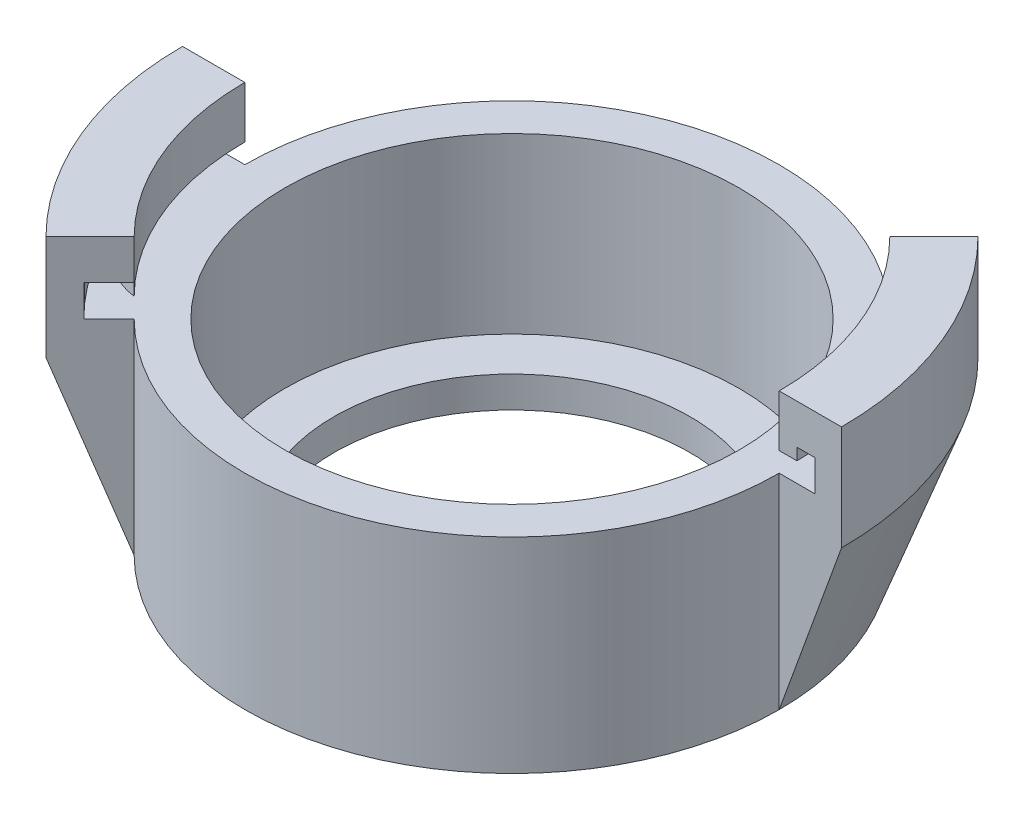
ISO-10303-21;
HEADER;
FILE_DESCRIPTION(('STEP AP214'),'2;1');
FILE_NAME('part.step','',(''),(''),'','','');
FILE_SCHEMA(('AUTOMOTIVE_DESIGN { 1 0 10303 214 1 1 1 1 }'));
ENDSEC;
DATA;
#1=APPLICATION_CONTEXT('core data for automotive mechanical design processes');
#2=APPLICATION_PROTOCOL_DEFINITION('international standard','automotive_design',2000,#1);
#3=PRODUCT_CONTEXT('',#1,'mechanical');
#4=PRODUCT('Part','Part','',(#3));
#5=PRODUCT_RELATED_PRODUCT_CATEGORY('part','',(#4));
#6=PRODUCT_DEFINITION_FORMATION('','',#4);
#7=PRODUCT_DEFINITION_CONTEXT('part definition',#1,'design');
#8=PRODUCT_DEFINITION('design','',#6,#7);
#9=PRODUCT_DEFINITION_SHAPE('','',#8);
#10=(LENGTH_UNIT() NAMED_UNIT(*) SI_UNIT(.MILLI.,.METRE.));
#11=(NAMED_UNIT(*) PLANE_ANGLE_UNIT() SI_UNIT($,.RADIAN.));
#12=(NAMED_UNIT(*) SI_UNIT($,.STERADIAN.) SOLID_ANGLE_UNIT());
#13=UNCERTAINTY_MEASURE_WITH_UNIT(LENGTH_MEASURE(1.E-05),#10,'distance_accuracy_value','');
#14=(GEOMETRIC_REPRESENTATION_CONTEXT(3) GLOBAL_UNCERTAINTY_ASSIGNED_CONTEXT((#13)) GLOBAL_UNIT_ASSIGNED_CONTEXT((#10,
#11,#12)) REPRESENTATION_CONTEXT('',''));
#15=CARTESIAN_POINT('',(0.,0.,0.));
#16=DIRECTION('',(0.,0.,1.));
#17=DIRECTION('',(1.,0.,0.));
#18=AXIS2_PLACEMENT_3D('',#15,#16,#17);
#19=CARTESIAN_POINT('',(0.,23.,0.));
#20=DIRECTION('',(0.,-1.,0.));
#21=DIRECTION('',(0.,0.,-1.));
#22=AXIS2_PLACEMENT_3D('',#19,#20,#21);
#23=CYLINDRICAL_SURFACE('',#22,30.);
#24=DIRECTION('',(0.,1.,0.));
#25=VECTOR('',#24,1.);
#26=CARTESIAN_POINT('',(21.2132034355964,0.,-21.2132034355964));
#27=LINE('',#26,#25);
#28=CARTESIAN_POINT('',(21.2132034355964,0.,-21.2132034355964));
#29=VERTEX_POINT('',#28);
#30=CARTESIAN_POINT('',(21.2132034355964,23.,-21.2132034355964));
#31=VERTEX_POINT('',#30);
#32=EDGE_CURVE('E255',#29,#31,#27,.T.);
#33=ORIENTED_EDGE('',*,*,#32,.F.);
#34=CARTESIAN_POINT('',(0.,0.,0.));
#35=DIRECTION('',(0.,1.,0.));
#36=DIRECTION('',(0.,0.,1.));
#37=AXIS2_PLACEMENT_3D('',#34,#35,#36);
#38=CIRCLE('',#37,30.);
#39=CARTESIAN_POINT('',(-30.,0.,0.));
#40=VERTEX_POINT('',#39);
#41=EDGE_CURVE('E399',#29,#40,#38,.T.);
#42=ORIENTED_EDGE('',*,*,#41,.T.);
#43=DIRECTION('',(0.,1.,0.));
#44=VECTOR('',#43,1.);
#45=CARTESIAN_POINT('',(-30.,0.,0.));
#46=LINE('',#45,#44);
#47=CARTESIAN_POINT('',(-30.,23.,0.));
#48=VERTEX_POINT('',#47);
#49=EDGE_CURVE('E324',#40,#48,#46,.T.);
#50=ORIENTED_EDGE('',*,*,#49,.T.);
#51=CARTESIAN_POINT('',(0.,23.,0.));
#52=DIRECTION('',(0.,1.,0.));
#53=DIRECTION('',(0.,0.,1.));
#54=AXIS2_PLACEMENT_3D('',#51,#52,#53);
#55=CIRCLE('',#54,30.);
#56=EDGE_CURVE('E404',#31,#48,#55,.T.);
#57=ORIENTED_EDGE('',*,*,#56,.F.);
#58=EDGE_LOOP('',(#33,#42,#50,#57));
#59=FACE_BOUND('',#58,.T.);
#60=ADVANCED_FACE('F41',(#59),#23,.T.);
#61=CARTESIAN_POINT('',(0.,23.,0.));
#62=DIRECTION('',(0.,1.,0.));
#63=DIRECTION('',(0.,0.,1.));
#64=AXIS2_PLACEMENT_3D('',#61,#62,#63);
#65=PLANE('',#64);
#66=CARTESIAN_POINT('',(-21.2132034355964,23.,21.2132034355965));
#67=VERTEX_POINT('',#66);
#68=CARTESIAN_POINT('',(30.,23.,0.));
#69=VERTEX_POINT('',#68);
#70=EDGE_CURVE('E400',#67,#69,#55,.T.);
#71=ORIENTED_EDGE('',*,*,#70,.T.);
#72=DIRECTION('',(-1.,0.,0.));
#73=VECTOR('',#72,1.);
#74=CARTESIAN_POINT('',(0.,23.,0.));
#75=LINE('',#74,#73);
#76=CARTESIAN_POINT('',(34.,23.,0.));
#77=VERTEX_POINT('',#76);
#78=EDGE_CURVE('E277',#77,#69,#75,.T.);
#79=ORIENTED_EDGE('',*,*,#78,.F.);
#80=CARTESIAN_POINT('',(0.,23.,0.));
#81=DIRECTION('',(0.,1.,0.));
#82=DIRECTION('',(-0.707106781186548,0.,-0.707106781186547));
#83=AXIS2_PLACEMENT_3D('',#80,#81,#82);
#84=CIRCLE('',#83,34.);
#85=CARTESIAN_POINT('',(24.0416305603426,23.,-24.0416305603426));
#86=VERTEX_POINT('',#85);
#87=EDGE_CURVE('E315',#77,#86,#84,.T.);
#88=ORIENTED_EDGE('',*,*,#87,.T.);
#89=DIRECTION('',(-0.707106781186547,0.,0.707106781186548));
#90=VECTOR('',#89,1.);
#91=CARTESIAN_POINT('',(0.,23.,0.));
#92=LINE('',#91,#90);
#93=EDGE_CURVE('E258',#86,#31,#92,.T.);
#94=ORIENTED_EDGE('',*,*,#93,.T.);
#95=ORIENTED_EDGE('',*,*,#56,.T.);
#96=DIRECTION('',(1.,0.,0.));
#97=VECTOR('',#96,1.);
#98=CARTESIAN_POINT('',(0.,23.,0.));
#99=LINE('',#98,#97);
#100=CARTESIAN_POINT('',(-34.,23.,0.));
#101=VERTEX_POINT('',#100);
#102=EDGE_CURVE('E327',#101,#48,#99,.T.);
#103=ORIENTED_EDGE('',*,*,#102,.F.);
#104=CARTESIAN_POINT('',(0.,23.,0.));
#105=DIRECTION('',(0.,-1.,0.));
#106=DIRECTION('',(0.,0.,-1.));
#107=AXIS2_PLACEMENT_3D('',#104,#105,#106);
#108=CIRCLE('',#107,34.);
#109=CARTESIAN_POINT('',(-24.0416305603426,23.,24.0416305603427));
#110=VERTEX_POINT('',#109);
#111=EDGE_CURVE('E388',#110,#101,#108,.T.);
#112=ORIENTED_EDGE('',*,*,#111,.F.);
#113=DIRECTION('',(0.707106781186546,0.,-0.707106781186549));
#114=VECTOR('',#113,1.);
#115=CARTESIAN_POINT('',(0.,23.,0.));
#116=LINE('',#115,#114);
#117=EDGE_CURVE('E357',#110,#67,#116,.T.);
#118=ORIENTED_EDGE('',*,*,#117,.T.);
#119=EDGE_LOOP('',(#71,#79,#88,#94,#95,#103,#112,#118));
#120=FACE_BOUND('',#119,.T.);
#121=CARTESIAN_POINT('',(0.,23.,0.));
#122=DIRECTION('',(0.,1.,0.));
#123=DIRECTION('',(0.,0.,1.));
#124=AXIS2_PLACEMENT_3D('',#121,#122,#123);
#125=CIRCLE('',#124,25.5);
#126=CARTESIAN_POINT('',(0.,23.,25.5));
#127=VERTEX_POINT('',#126);
#128=EDGE_CURVE('E394',#127,#127,#125,.T.);
#129=ORIENTED_EDGE('',*,*,#128,.F.);
#130=EDGE_LOOP('',(#129));
#131=FACE_BOUND('',#130,.T.);
#132=ADVANCED_FACE('F470',(#120,#131),#65,.T.);
#133=CARTESIAN_POINT('',(0.,0.,0.));
#134=DIRECTION('',(0.,1.,0.));
#135=DIRECTION('',(0.,0.,1.));
#136=AXIS2_PLACEMENT_3D('',#133,#134,#135);
#137=PLANE('',#136);
#138=CARTESIAN_POINT('',(-21.2132034355964,0.,21.2132034355965));
#139=VERTEX_POINT('',#138);
#140=EDGE_CURVE('E405',#40,#139,#38,.T.);
#141=ORIENTED_EDGE('',*,*,#140,.F.);
#142=ORIENTED_EDGE('',*,*,#41,.F.);
#143=CARTESIAN_POINT('',(0.,0.,0.));
#144=DIRECTION('',(0.,1.,0.));
#145=DIRECTION('',(-0.707106781186548,0.,-0.707106781186547));
#146=AXIS2_PLACEMENT_3D('',#143,#144,#145);
#147=CIRCLE('',#146,30.);
#148=CARTESIAN_POINT('',(30.,0.,0.));
#149=VERTEX_POINT('',#148);
#150=EDGE_CURVE('E318',#149,#29,#147,.T.);
#151=ORIENTED_EDGE('',*,*,#150,.F.);
#152=EDGE_CURVE('E408',#139,#149,#38,.T.);
#153=ORIENTED_EDGE('',*,*,#152,.F.);
#154=EDGE_LOOP('',(#141,#142,#151,#153));
#155=FACE_BOUND('',#154,.T.);
#156=CARTESIAN_POINT('',(0.,0.,0.));
#157=DIRECTION('',(0.,1.,0.));
#158=DIRECTION('',(0.,0.,1.));
#159=AXIS2_PLACEMENT_3D('',#156,#157,#158);
#160=CIRCLE('',#159,20.);
#161=CARTESIAN_POINT('',(0.,0.,20.));
#162=VERTEX_POINT('',#161);
#163=EDGE_CURVE('E390',#162,#162,#160,.T.);
#164=ORIENTED_EDGE('',*,*,#163,.T.);
#165=EDGE_LOOP('',(#164));
#166=FACE_BOUND('',#165,.T.);
#167=ADVANCED_FACE('F476',(#155,#166),#137,.F.);
#168=ORIENTED_EDGE('',*,*,#152,.T.);
#169=DIRECTION('',(0.,1.,0.));
#170=VECTOR('',#169,1.);
#171=CARTESIAN_POINT('',(30.,0.,0.));
#172=LINE('',#171,#170);
#173=EDGE_CURVE('E275',#149,#69,#172,.T.);
#174=ORIENTED_EDGE('',*,*,#173,.T.);
#175=ORIENTED_EDGE('',*,*,#70,.F.);
#176=DIRECTION('',(0.,1.,0.));
#177=VECTOR('',#176,1.);
#178=CARTESIAN_POINT('',(-21.2132034355964,0.,21.2132034355965));
#179=LINE('',#178,#177);
#180=EDGE_CURVE('E354',#139,#67,#179,.T.);
#181=ORIENTED_EDGE('',*,*,#180,.F.);
#182=EDGE_LOOP('',(#168,#174,#175,#181));
#183=FACE_BOUND('',#182,.T.);
#184=ADVANCED_FACE('F43',(#183),#23,.T.);
#185=CARTESIAN_POINT('',(0.,23.,0.));
#186=DIRECTION('',(0.,-1.,0.));
#187=DIRECTION('',(0.,0.,-1.));
#188=AXIS2_PLACEMENT_3D('',#185,#186,#187);
#189=CYLINDRICAL_SURFACE('',#188,25.5);
#190=CARTESIAN_POINT('',(0.,3.5,0.));
#191=DIRECTION('',(0.,1.,0.));
#192=DIRECTION('',(0.,0.,1.));
#193=AXIS2_PLACEMENT_3D('',#190,#191,#192);
#194=CIRCLE('',#193,25.5);
#195=CARTESIAN_POINT('',(0.,3.5,25.5));
#196=VERTEX_POINT('',#195);
#197=EDGE_CURVE('E403',#196,#196,#194,.T.);
#198=ORIENTED_EDGE('',*,*,#197,.F.);
#199=EDGE_LOOP('',(#198));
#200=FACE_BOUND('',#199,.T.);
#201=ORIENTED_EDGE('',*,*,#128,.T.);
#202=EDGE_LOOP('',(#201));
#203=FACE_BOUND('',#202,.T.);
#204=ADVANCED_FACE('F480',(#200,#203),#189,.F.);
#205=CARTESIAN_POINT('',(0.,3.5,0.));
#206=DIRECTION('',(0.,1.,0.));
#207=DIRECTION('',(0.,0.,1.));
#208=AXIS2_PLACEMENT_3D('',#205,#206,#207);
#209=PLANE('',#208);
#210=ORIENTED_EDGE('',*,*,#197,.T.);
#211=EDGE_LOOP('',(#210));
#212=FACE_BOUND('',#211,.T.);
#213=CARTESIAN_POINT('',(0.,3.5,0.));
#214=DIRECTION('',(0.,1.,0.));
#215=DIRECTION('',(0.,0.,1.));
#216=AXIS2_PLACEMENT_3D('',#213,#214,#215);
#217=CIRCLE('',#216,20.);
#218=CARTESIAN_POINT('',(0.,3.5,20.));
#219=VERTEX_POINT('',#218);
#220=EDGE_CURVE('E391',#219,#219,#217,.T.);
#221=ORIENTED_EDGE('',*,*,#220,.F.);
#222=EDGE_LOOP('',(#221));
#223=FACE_BOUND('',#222,.T.);
#224=ADVANCED_FACE('F487',(#212,#223),#209,.T.);
#225=CARTESIAN_POINT('',(0.,3.5,0.));
#226=DIRECTION('',(0.,-1.,0.));
#227=DIRECTION('',(0.,0.,-1.));
#228=AXIS2_PLACEMENT_3D('',#225,#226,#227);
#229=CYLINDRICAL_SURFACE('',#228,20.);
#230=ORIENTED_EDGE('',*,*,#220,.T.);
#231=EDGE_LOOP('',(#230));
#232=FACE_BOUND('',#231,.T.);
#233=ORIENTED_EDGE('',*,*,#163,.F.);
#234=EDGE_LOOP('',(#233));
#235=FACE_BOUND('',#234,.T.);
#236=ADVANCED_FACE('F570',(#232,#235),#229,.F.);
#237=CARTESIAN_POINT('',(0.,0.,0.));
#238=DIRECTION('',(0.,1.,0.));
#239=DIRECTION('',(0.,0.,1.));
#240=AXIS2_PLACEMENT_3D('',#237,#238,#239);
#241=CONICAL_SURFACE('',#240,30.,0.349104990963465);
#242=ORIENTED_EDGE('',*,*,#140,.T.);
#243=DIRECTION('',(-0.241870769920647,0.939679233204601,0.241870769920648));
#244=VECTOR('',#243,1.);
#245=CARTESIAN_POINT('',(-18.7311962947298,-9.64271361811531,18.7311962947299));
#246=LINE('',#245,#244);
#247=CARTESIAN_POINT('',(-26.1629509039022,19.23,26.1629509039023));
#248=VERTEX_POINT('',#247);
#249=EDGE_CURVE('E351',#139,#248,#246,.T.);
#250=ORIENTED_EDGE('',*,*,#249,.T.);
#251=CARTESIAN_POINT('',(0.,19.23,0.));
#252=DIRECTION('',(0.,-1.,0.));
#253=DIRECTION('',(0.,0.,-1.));
#254=AXIS2_PLACEMENT_3D('',#251,#252,#253);
#255=CIRCLE('',#254,37.);
#256=CARTESIAN_POINT('',(-37.,19.23,0.));
#257=VERTEX_POINT('',#256);
#258=EDGE_CURVE('E374',#248,#257,#255,.T.);
#259=ORIENTED_EDGE('',*,*,#258,.T.);
#260=DIRECTION('',(-0.342056923163402,0.939679233204601,0.));
#261=VECTOR('',#260,1.);
#262=CARTESIAN_POINT('',(-26.4899118394796,-9.64271361811531,0.));
#263=LINE('',#262,#261);
#264=EDGE_CURVE('E321',#40,#257,#263,.T.);
#265=ORIENTED_EDGE('',*,*,#264,.F.);
#266=EDGE_LOOP('',(#242,#250,#259,#265));
#267=FACE_BOUND('',#266,.T.);
#268=ADVANCED_FACE('F540',(#267),#241,.T.);
#269=CARTESIAN_POINT('',(0.,0.,0.));
#270=DIRECTION('',(0.,-1.,0.));
#271=DIRECTION('',(0.,0.,-1.));
#272=AXIS2_PLACEMENT_3D('',#269,#270,#271);
#273=CYLINDRICAL_SURFACE('',#272,34.);
#274=CARTESIAN_POINT('',(0.,26.5196514633318,0.));
#275=DIRECTION('',(0.,-1.,0.));
#276=DIRECTION('',(0.,0.,-1.));
#277=AXIS2_PLACEMENT_3D('',#274,#275,#276);
#278=CIRCLE('',#277,34.);
#279=CARTESIAN_POINT('',(-24.0416305603426,26.5196514633318,24.0416305603427));
#280=VERTEX_POINT('',#279);
#281=CARTESIAN_POINT('',(-34.,26.5196514633318,0.));
#282=VERTEX_POINT('',#281);
#283=EDGE_CURVE('E386',#280,#282,#278,.T.);
#284=ORIENTED_EDGE('',*,*,#283,.F.);
#285=DIRECTION('',(0.,-1.,0.));
#286=VECTOR('',#285,1.);
#287=CARTESIAN_POINT('',(-24.0416305603426,0.,24.0416305603427));
#288=LINE('',#287,#286);
#289=EDGE_CURVE('E360',#280,#110,#288,.T.);
#290=ORIENTED_EDGE('',*,*,#289,.T.);
#291=ORIENTED_EDGE('',*,*,#111,.T.);
#292=DIRECTION('',(0.,-1.,0.));
#293=VECTOR('',#292,1.);
#294=CARTESIAN_POINT('',(-34.,0.,0.));
#295=LINE('',#294,#293);
#296=EDGE_CURVE('E330',#282,#101,#295,.T.);
#297=ORIENTED_EDGE('',*,*,#296,.F.);
#298=EDGE_LOOP('',(#284,#290,#291,#297));
#299=FACE_BOUND('',#298,.T.);
#300=ADVANCED_FACE('F432',(#299),#273,.F.);
#301=CARTESIAN_POINT('',(0.,26.5196514633318,0.));
#302=DIRECTION('',(0.,-1.,0.));
#303=DIRECTION('',(0.,0.,-1.));
#304=AXIS2_PLACEMENT_3D('',#301,#302,#303);
#305=PLANE('',#304);
#306=DIRECTION('',(-0.227602896185762,0.,-0.973754035497596));
#307=VECTOR('',#306,1.);
#308=CARTESIAN_POINT('',(-29.0437776567196,26.5196514633318,6.78862183864194));
#309=LINE('',#308,#307);
#310=CARTESIAN_POINT('',(-25.6722110926262,26.5196514633318,21.2132034355965));
#311=VERTEX_POINT('',#310);
#312=CARTESIAN_POINT('',(-26.4054134353672,26.5196514633318,18.0763420333686));
#313=VERTEX_POINT('',#312);
#314=EDGE_CURVE('E250',#311,#313,#309,.T.);
#315=ORIENTED_EDGE('',*,*,#314,.F.);
#316=DIRECTION('',(-0.694720375088052,0.,-0.719279917999603));
#317=VECTOR('',#316,1.);
#318=CARTESIAN_POINT('',(-23.8820716837365,26.5196514633318,23.0666273071374));
#319=LINE('',#318,#317);
#320=CARTESIAN_POINT('',(-23.4814311563308,26.5196514633318,23.4814311563309));
#321=VERTEX_POINT('',#320);
#322=EDGE_CURVE('E242',#321,#311,#319,.T.);
#323=ORIENTED_EDGE('',*,*,#322,.F.);
#324=DIRECTION('',(-0.707106781186546,0.,0.707106781186549));
#325=VECTOR('',#324,1.);
#326=CARTESIAN_POINT('',(0.,26.5196514633318,0.));
#327=LINE('',#326,#325);
#328=EDGE_CURVE('E363',#321,#280,#327,.T.);
#329=ORIENTED_EDGE('',*,*,#328,.T.);
#330=ORIENTED_EDGE('',*,*,#283,.T.);
#331=DIRECTION('',(-1.,0.,0.));
#332=VECTOR('',#331,1.);
#333=CARTESIAN_POINT('',(0.,26.5196514633318,0.));
#334=LINE('',#333,#332);
#335=CARTESIAN_POINT('',(-32.,26.5196514633318,0.));
#336=VERTEX_POINT('',#335);
#337=EDGE_CURVE('E333',#336,#282,#334,.T.);
#338=ORIENTED_EDGE('',*,*,#337,.F.);
#339=CARTESIAN_POINT('',(0.,26.5196514633318,0.));
#340=DIRECTION('',(0.,-1.,0.));
#341=DIRECTION('',(0.,0.,-1.));
#342=AXIS2_PLACEMENT_3D('',#339,#340,#341);
#343=CIRCLE('',#342,32.);
#344=EDGE_CURVE('E384',#313,#336,#343,.T.);
#345=ORIENTED_EDGE('',*,*,#344,.F.);
#346=EDGE_LOOP('',(#315,#323,#329,#330,#338,#345));
#347=FACE_BOUND('',#346,.T.);
#348=ADVANCED_FACE('F425',(#347),#305,.T.);
#349=CARTESIAN_POINT('',(0.,0.,0.));
#350=DIRECTION('',(0.,-1.,0.));
#351=DIRECTION('',(0.,0.,-1.));
#352=AXIS2_PLACEMENT_3D('',#349,#350,#351);
#353=CYLINDRICAL_SURFACE('',#352,32.);
#354=DIRECTION('',(0.,-1.,0.));
#355=VECTOR('',#354,1.);
#356=CARTESIAN_POINT('',(-26.4054134353672,26.52,18.0763420333686));
#357=LINE('',#356,#355);
#358=CARTESIAN_POINT('',(-26.4054134353672,25.2,18.0763420333686));
#359=VERTEX_POINT('',#358);
#360=EDGE_CURVE('E243',#313,#359,#357,.T.);
#361=ORIENTED_EDGE('',*,*,#360,.F.);
#362=ORIENTED_EDGE('',*,*,#344,.T.);
#363=DIRECTION('',(0.,1.,0.));
#364=VECTOR('',#363,1.);
#365=CARTESIAN_POINT('',(-32.,0.,0.));
#366=LINE('',#365,#364);
#367=CARTESIAN_POINT('',(-32.,25.2,0.));
#368=VERTEX_POINT('',#367);
#369=EDGE_CURVE('E336',#368,#336,#366,.T.);
#370=ORIENTED_EDGE('',*,*,#369,.F.);
#371=CARTESIAN_POINT('',(0.,25.2,0.));
#372=DIRECTION('',(0.,-1.,0.));
#373=DIRECTION('',(0.,0.,-1.));
#374=AXIS2_PLACEMENT_3D('',#371,#372,#373);
#375=CIRCLE('',#374,32.);
#376=EDGE_CURVE('E382',#359,#368,#375,.T.);
#377=ORIENTED_EDGE('',*,*,#376,.F.);
#378=EDGE_LOOP('',(#361,#362,#370,#377));
#379=FACE_BOUND('',#378,.T.);
#380=ADVANCED_FACE('F443',(#379),#353,.T.);
#381=CARTESIAN_POINT('',(0.,25.2,0.));
#382=DIRECTION('',(0.,-1.,0.));
#383=DIRECTION('',(0.,0.,-1.));
#384=AXIS2_PLACEMENT_3D('',#381,#382,#383);
#385=PLANE('',#384);
#386=CARTESIAN_POINT('',(-20.3591460459456,25.2,13.9339792492937));
#387=DIRECTION('',(0.,1.,0.));
#388=DIRECTION('',(0.,0.,-1.));
#389=AXIS2_PLACEMENT_3D('',#386,#387,#388);
#390=CIRCLE('',#389,7.32915539330917);
#391=CARTESIAN_POINT('',(-21.2132034355964,25.2,21.2132034355965));
#392=VERTEX_POINT('',#391);
#393=EDGE_CURVE('E231',#359,#392,#390,.T.);
#394=ORIENTED_EDGE('',*,*,#393,.F.);
#395=ORIENTED_EDGE('',*,*,#376,.T.);
#396=DIRECTION('',(-1.,0.,0.));
#397=VECTOR('',#396,1.);
#398=CARTESIAN_POINT('',(0.,25.2,0.));
#399=LINE('',#398,#397);
#400=CARTESIAN_POINT('',(-30.,25.2,0.));
#401=VERTEX_POINT('',#400);
#402=EDGE_CURVE('E339',#401,#368,#399,.T.);
#403=ORIENTED_EDGE('',*,*,#402,.F.);
#404=CARTESIAN_POINT('',(0.,25.2,0.));
#405=DIRECTION('',(0.,-1.,0.));
#406=DIRECTION('',(0.,0.,-1.));
#407=AXIS2_PLACEMENT_3D('',#404,#405,#406);
#408=CIRCLE('',#407,30.);
#409=EDGE_CURVE('E380',#392,#401,#408,.T.);
#410=ORIENTED_EDGE('',*,*,#409,.F.);
#411=EDGE_LOOP('',(#394,#395,#403,#410));
#412=FACE_BOUND('',#411,.T.);
#413=ADVANCED_FACE('F449',(#412),#385,.T.);
#414=CARTESIAN_POINT('',(0.,0.,0.));
#415=DIRECTION('',(0.,-1.,0.));
#416=DIRECTION('',(0.,0.,-1.));
#417=AXIS2_PLACEMENT_3D('',#414,#415,#416);
#418=CYLINDRICAL_SURFACE('',#417,30.);
#419=CARTESIAN_POINT('',(0.,31.,0.));
#420=DIRECTION('',(0.,-1.,0.));
#421=DIRECTION('',(0.,0.,-1.));
#422=AXIS2_PLACEMENT_3D('',#419,#420,#421);
#423=CIRCLE('',#422,30.);
#424=CARTESIAN_POINT('',(-21.2132034355964,31.,21.2132034355965));
#425=VERTEX_POINT('',#424);
#426=CARTESIAN_POINT('',(-30.,31.,0.));
#427=VERTEX_POINT('',#426);
#428=EDGE_CURVE('E378',#425,#427,#423,.T.);
#429=ORIENTED_EDGE('',*,*,#428,.F.);
#430=DIRECTION('',(0.,-1.,0.));
#431=VECTOR('',#430,1.);
#432=CARTESIAN_POINT('',(-21.2132034355964,0.,21.2132034355965));
#433=LINE('',#432,#431);
#434=CARTESIAN_POINT('',(-21.2132034355964,26.52,21.2132034355965));
#435=VERTEX_POINT('',#434);
#436=EDGE_CURVE('E365',#425,#435,#433,.T.);
#437=ORIENTED_EDGE('',*,*,#436,.T.);
#438=DIRECTION('',(0.,-1.,0.));
#439=VECTOR('',#438,1.);
#440=CARTESIAN_POINT('',(-21.2132034355964,26.52,21.2132034355965));
#441=LINE('',#440,#439);
#442=EDGE_CURVE('E237',#435,#392,#441,.T.);
#443=ORIENTED_EDGE('',*,*,#442,.T.);
#444=ORIENTED_EDGE('',*,*,#409,.T.);
#445=DIRECTION('',(0.,-1.,0.));
#446=VECTOR('',#445,1.);
#447=CARTESIAN_POINT('',(-30.,0.,0.));
#448=LINE('',#447,#446);
#449=EDGE_CURVE('E342',#427,#401,#448,.T.);
#450=ORIENTED_EDGE('',*,*,#449,.F.);
#451=EDGE_LOOP('',(#429,#437,#443,#444,#450));
#452=FACE_BOUND('',#451,.T.);
#453=ADVANCED_FACE('F452',(#452),#418,.F.);
#454=CARTESIAN_POINT('',(0.,31.,0.));
#455=DIRECTION('',(0.,1.,0.));
#456=DIRECTION('',(0.,0.,1.));
#457=AXIS2_PLACEMENT_3D('',#454,#455,#456);
#458=PLANE('',#457);
#459=CARTESIAN_POINT('',(0.,31.,0.));
#460=DIRECTION('',(0.,-1.,0.));
#461=DIRECTION('',(0.,0.,-1.));
#462=AXIS2_PLACEMENT_3D('',#459,#460,#461);
#463=CIRCLE('',#462,37.);
#464=CARTESIAN_POINT('',(-26.1629509039022,31.,26.1629509039023));
#465=VERTEX_POINT('',#464);
#466=CARTESIAN_POINT('',(-37.,31.,0.));
#467=VERTEX_POINT('',#466);
#468=EDGE_CURVE('E376',#465,#467,#463,.T.);
#469=ORIENTED_EDGE('',*,*,#468,.F.);
#470=DIRECTION('',(0.707106781186546,0.,-0.707106781186549));
#471=VECTOR('',#470,1.);
#472=CARTESIAN_POINT('',(0.,31.,0.));
#473=LINE('',#472,#471);
#474=EDGE_CURVE('E368',#465,#425,#473,.T.);
#475=ORIENTED_EDGE('',*,*,#474,.T.);
#476=ORIENTED_EDGE('',*,*,#428,.T.);
#477=DIRECTION('',(1.,0.,0.));
#478=VECTOR('',#477,1.);
#479=CARTESIAN_POINT('',(0.,31.,0.));
#480=LINE('',#479,#478);
#481=EDGE_CURVE('E345',#467,#427,#480,.T.);
#482=ORIENTED_EDGE('',*,*,#481,.F.);
#483=EDGE_LOOP('',(#469,#475,#476,#482));
#484=FACE_BOUND('',#483,.T.);
#485=ADVANCED_FACE('F551',(#484),#458,.T.);
#486=CARTESIAN_POINT('',(0.,0.,0.));
#487=DIRECTION('',(0.,-1.,0.));
#488=DIRECTION('',(0.,0.,-1.));
#489=AXIS2_PLACEMENT_3D('',#486,#487,#488);
#490=CYLINDRICAL_SURFACE('',#489,37.);
#491=DIRECTION('',(0.,1.,0.));
#492=VECTOR('',#491,1.);
#493=CARTESIAN_POINT('',(-26.1629509039022,0.,26.1629509039023));
#494=LINE('',#493,#492);
#495=EDGE_CURVE('E371',#248,#465,#494,.T.);
#496=ORIENTED_EDGE('',*,*,#495,.T.);
#497=ORIENTED_EDGE('',*,*,#468,.T.);
#498=DIRECTION('',(0.,1.,0.));
#499=VECTOR('',#498,1.);
#500=CARTESIAN_POINT('',(-37.,0.,0.));
#501=LINE('',#500,#499);
#502=EDGE_CURVE('E348',#257,#467,#501,.T.);
#503=ORIENTED_EDGE('',*,*,#502,.F.);
#504=ORIENTED_EDGE('',*,*,#258,.F.);
#505=EDGE_LOOP('',(#496,#497,#503,#504));
#506=FACE_BOUND('',#505,.T.);
#507=ADVANCED_FACE('F548',(#506),#490,.T.);
#508=CARTESIAN_POINT('',(0.,0.,0.));
#509=DIRECTION('',(0.707106781186549,0.,0.707106781186546));
#510=DIRECTION('',(0.707106781186546,0.,-0.707106781186549));
#511=AXIS2_PLACEMENT_3D('',#508,#509,#510);
#512=PLANE('',#511);
#513=DIRECTION('',(0.,-1.,0.));
#514=VECTOR('',#513,1.);
#515=CARTESIAN_POINT('',(-23.4814311563308,0.,23.4814311563309));
#516=LINE('',#515,#514);
#517=CARTESIAN_POINT('',(-23.4814311563308,26.52,23.4814311563309));
#518=VERTEX_POINT('',#517);
#519=EDGE_CURVE('E414',#518,#321,#516,.T.);
#520=ORIENTED_EDGE('',*,*,#519,.F.);
#521=DIRECTION('',(0.707106781186546,0.,-0.707106781186549));
#522=VECTOR('',#521,1.);
#523=CARTESIAN_POINT('',(0.,26.52,0.));
#524=LINE('',#523,#522);
#525=EDGE_CURVE('E411',#518,#435,#524,.T.);
#526=ORIENTED_EDGE('',*,*,#525,.T.);
#527=ORIENTED_EDGE('',*,*,#436,.F.);
#528=ORIENTED_EDGE('',*,*,#474,.F.);
#529=ORIENTED_EDGE('',*,*,#495,.F.);
#530=ORIENTED_EDGE('',*,*,#249,.F.);
#531=ORIENTED_EDGE('',*,*,#180,.T.);
#532=ORIENTED_EDGE('',*,*,#117,.F.);
#533=ORIENTED_EDGE('',*,*,#289,.F.);
#534=ORIENTED_EDGE('',*,*,#328,.F.);
#535=EDGE_LOOP('',(#520,#526,#527,#528,#529,#530,#531,#532,#533,#534));
#536=FACE_BOUND('',#535,.T.);
#537=ADVANCED_FACE('F429',(#536),#512,.T.);
#538=CARTESIAN_POINT('',(0.,0.,0.));
#539=DIRECTION('',(0.,0.,1.));
#540=DIRECTION('',(1.,0.,0.));
#541=AXIS2_PLACEMENT_3D('',#538,#539,#540);
#542=PLANE('',#541);
#543=ORIENTED_EDGE('',*,*,#264,.T.);
#544=ORIENTED_EDGE('',*,*,#502,.T.);
#545=ORIENTED_EDGE('',*,*,#481,.T.);
#546=ORIENTED_EDGE('',*,*,#449,.T.);
#547=ORIENTED_EDGE('',*,*,#402,.T.);
#548=ORIENTED_EDGE('',*,*,#369,.T.);
#549=ORIENTED_EDGE('',*,*,#337,.T.);
#550=ORIENTED_EDGE('',*,*,#296,.T.);
#551=ORIENTED_EDGE('',*,*,#102,.T.);
#552=ORIENTED_EDGE('',*,*,#49,.F.);
#553=EDGE_LOOP('',(#543,#544,#545,#546,#547,#548,#549,#550,#551,#552));
#554=FACE_BOUND('',#553,.T.);
#555=ADVANCED_FACE('F438',(#554),#542,.F.);
#556=CARTESIAN_POINT('',(0.,0.,0.));
#557=DIRECTION('',(0.,1.,0.));
#558=DIRECTION('',(0.707106781186548,0.,0.707106781186547));
#559=AXIS2_PLACEMENT_3D('',#556,#557,#558);
#560=CONICAL_SURFACE('',#559,30.,0.349104990963465);
#561=ORIENTED_EDGE('',*,*,#150,.T.);
#562=DIRECTION('',(0.241870769920647,0.939679233204601,-0.241870769920647));
#563=VECTOR('',#562,1.);
#564=CARTESIAN_POINT('',(18.7311962947298,-9.64271361811531,-18.7311962947298));
#565=LINE('',#564,#563);
#566=CARTESIAN_POINT('',(26.1629509039023,19.23,-26.1629509039023));
#567=VERTEX_POINT('',#566);
#568=EDGE_CURVE('E252',#29,#567,#565,.T.);
#569=ORIENTED_EDGE('',*,*,#568,.T.);
#570=CARTESIAN_POINT('',(0.,19.23,0.));
#571=DIRECTION('',(0.,1.,0.));
#572=DIRECTION('',(-0.707106781186548,0.,-0.707106781186547));
#573=AXIS2_PLACEMENT_3D('',#570,#571,#572);
#574=CIRCLE('',#573,37.);
#575=CARTESIAN_POINT('',(37.,19.23,0.));
#576=VERTEX_POINT('',#575);
#577=EDGE_CURVE('E294',#576,#567,#574,.T.);
#578=ORIENTED_EDGE('',*,*,#577,.F.);
#579=DIRECTION('',(0.342056923163402,0.939679233204601,0.));
#580=VECTOR('',#579,1.);
#581=CARTESIAN_POINT('',(26.4899118394796,-9.64271361811531,0.));
#582=LINE('',#581,#580);
#583=EDGE_CURVE('E272',#149,#576,#582,.T.);
#584=ORIENTED_EDGE('',*,*,#583,.F.);
#585=EDGE_LOOP('',(#561,#569,#578,#584));
#586=FACE_BOUND('',#585,.T.);
#587=ADVANCED_FACE('F501',(#586),#560,.T.);
#588=CARTESIAN_POINT('',(0.,0.,0.));
#589=DIRECTION('',(0.,-1.,0.));
#590=DIRECTION('',(-0.707106781186548,0.,-0.707106781186547));
#591=AXIS2_PLACEMENT_3D('',#588,#589,#590);
#592=CYLINDRICAL_SURFACE('',#591,34.);
#593=CARTESIAN_POINT('',(0.,26.5196514633318,0.));
#594=DIRECTION('',(0.,1.,0.));
#595=DIRECTION('',(-0.707106781186548,0.,-0.707106781186547));
#596=AXIS2_PLACEMENT_3D('',#593,#594,#595);
#597=CIRCLE('',#596,34.);
#598=CARTESIAN_POINT('',(34.,26.5196514633318,0.));
#599=VERTEX_POINT('',#598);
#600=CARTESIAN_POINT('',(24.0416305603426,26.5196514633318,-24.0416305603426));
#601=VERTEX_POINT('',#600);
#602=EDGE_CURVE('E312',#599,#601,#597,.T.);
#603=ORIENTED_EDGE('',*,*,#602,.T.);
#604=DIRECTION('',(0.,-1.,0.));
#605=VECTOR('',#604,1.);
#606=CARTESIAN_POINT('',(24.0416305603426,0.,-24.0416305603426));
#607=LINE('',#606,#605);
#608=EDGE_CURVE('E261',#601,#86,#607,.T.);
#609=ORIENTED_EDGE('',*,*,#608,.T.);
#610=ORIENTED_EDGE('',*,*,#87,.F.);
#611=DIRECTION('',(0.,-1.,0.));
#612=VECTOR('',#611,1.);
#613=CARTESIAN_POINT('',(34.,0.,0.));
#614=LINE('',#613,#612);
#615=EDGE_CURVE('E280',#599,#77,#614,.T.);
#616=ORIENTED_EDGE('',*,*,#615,.F.);
#617=EDGE_LOOP('',(#603,#609,#610,#616));
#618=FACE_BOUND('',#617,.T.);
#619=ADVANCED_FACE('F533',(#618),#592,.F.);
#620=CARTESIAN_POINT('',(0.,26.5196514633318,0.));
#621=DIRECTION('',(0.,-1.,0.));
#622=DIRECTION('',(-0.707106781186548,0.,-0.707106781186547));
#623=AXIS2_PLACEMENT_3D('',#620,#621,#622);
#624=PLANE('',#623);
#625=DIRECTION('',(0.490760869777449,0.,0.871294306589502));
#626=VECTOR('',#625,1.);
#627=CARTESIAN_POINT('',(27.7754774057872,26.5196514633318,-15.6446763706102));
#628=LINE('',#627,#626);
#629=CARTESIAN_POINT('',(23.4046394467846,26.5196514633318,-23.4046394467846));
#630=VERTEX_POINT('',#629);
#631=CARTESIAN_POINT('',(26.40776321236,26.5196514633318,-18.0729090663326));
#632=VERTEX_POINT('',#631);
#633=EDGE_CURVE('E218',#630,#632,#628,.T.);
#634=ORIENTED_EDGE('',*,*,#633,.F.);
#635=DIRECTION('',(0.707106781186547,0.,-0.707106781186548));
#636=VECTOR('',#635,1.);
#637=CARTESIAN_POINT('',(0.,26.5196514633318,0.));
#638=LINE('',#637,#636);
#639=EDGE_CURVE('E263',#630,#601,#638,.T.);
#640=ORIENTED_EDGE('',*,*,#639,.T.);
#641=ORIENTED_EDGE('',*,*,#602,.F.);
#642=DIRECTION('',(1.,0.,0.));
#643=VECTOR('',#642,1.);
#644=CARTESIAN_POINT('',(0.,26.5196514633318,0.));
#645=LINE('',#644,#643);
#646=CARTESIAN_POINT('',(32.,26.5196514633318,0.));
#647=VERTEX_POINT('',#646);
#648=EDGE_CURVE('E282',#647,#599,#645,.T.);
#649=ORIENTED_EDGE('',*,*,#648,.F.);
#650=CARTESIAN_POINT('',(0.,26.5196514633318,0.));
#651=DIRECTION('',(0.,1.,0.));
#652=DIRECTION('',(-0.707106781186548,0.,-0.707106781186547));
#653=AXIS2_PLACEMENT_3D('',#650,#651,#652);
#654=CIRCLE('',#653,32.);
#655=EDGE_CURVE('E309',#647,#632,#654,.T.);
#656=ORIENTED_EDGE('',*,*,#655,.T.);
#657=EDGE_LOOP('',(#634,#640,#641,#649,#656));
#658=FACE_BOUND('',#657,.T.);
#659=ADVANCED_FACE('F529',(#658),#624,.T.);
#660=CARTESIAN_POINT('',(0.,0.,0.));
#661=DIRECTION('',(0.,-1.,0.));
#662=DIRECTION('',(-0.707106781186548,0.,-0.707106781186547));
#663=AXIS2_PLACEMENT_3D('',#660,#661,#662);
#664=CYLINDRICAL_SURFACE('',#663,32.);
#665=DIRECTION('',(0.,-1.,0.));
#666=VECTOR('',#665,1.);
#667=CARTESIAN_POINT('',(26.40776321236,26.52,-18.0729090663326));
#668=LINE('',#667,#666);
#669=CARTESIAN_POINT('',(26.40776321236,25.2,-18.0729090663326));
#670=VERTEX_POINT('',#669);
#671=EDGE_CURVE('E221',#632,#670,#668,.T.);
#672=ORIENTED_EDGE('',*,*,#671,.F.);
#673=ORIENTED_EDGE('',*,*,#655,.F.);
#674=DIRECTION('',(0.,1.,0.));
#675=VECTOR('',#674,1.);
#676=CARTESIAN_POINT('',(32.,0.,0.));
#677=LINE('',#676,#675);
#678=CARTESIAN_POINT('',(32.,25.2,0.));
#679=VERTEX_POINT('',#678);
#680=EDGE_CURVE('E284',#679,#647,#677,.T.);
#681=ORIENTED_EDGE('',*,*,#680,.F.);
#682=CARTESIAN_POINT('',(0.,25.2,0.));
#683=DIRECTION('',(0.,1.,0.));
#684=DIRECTION('',(-0.707106781186548,0.,-0.707106781186547));
#685=AXIS2_PLACEMENT_3D('',#682,#683,#684);
#686=CIRCLE('',#685,32.);
#687=EDGE_CURVE('E306',#679,#670,#686,.T.);
#688=ORIENTED_EDGE('',*,*,#687,.T.);
#689=EDGE_LOOP('',(#672,#673,#681,#688));
#690=FACE_BOUND('',#689,.T.);
#691=ADVANCED_FACE('F523',(#690),#664,.T.);
#692=CARTESIAN_POINT('',(0.,25.2,0.));
#693=DIRECTION('',(0.,-1.,0.));
#694=DIRECTION('',(-0.707106781186548,0.,-0.707106781186547));
#695=AXIS2_PLACEMENT_3D('',#692,#693,#694);
#696=PLANE('',#695);
#697=CARTESIAN_POINT('',(20.3563267888014,25.2,-13.9293171901005));
#698=DIRECTION('',(0.,1.,0.));
#699=DIRECTION('',(0.,0.,-1.));
#700=AXIS2_PLACEMENT_3D('',#697,#698,#699);
#701=CIRCLE('',#700,7.33411456313224);
#702=CARTESIAN_POINT('',(21.2132034355964,25.2,-21.2132034355964));
#703=VERTEX_POINT('',#702);
#704=EDGE_CURVE('E225',#670,#703,#701,.T.);
#705=ORIENTED_EDGE('',*,*,#704,.F.);
#706=ORIENTED_EDGE('',*,*,#687,.F.);
#707=DIRECTION('',(1.,0.,0.));
#708=VECTOR('',#707,1.);
#709=CARTESIAN_POINT('',(0.,25.2,0.));
#710=LINE('',#709,#708);
#711=CARTESIAN_POINT('',(30.,25.2,0.));
#712=VERTEX_POINT('',#711);
#713=EDGE_CURVE('E286',#712,#679,#710,.T.);
#714=ORIENTED_EDGE('',*,*,#713,.F.);
#715=CARTESIAN_POINT('',(0.,25.2,0.));
#716=DIRECTION('',(0.,1.,0.));
#717=DIRECTION('',(-0.707106781186548,0.,-0.707106781186547));
#718=AXIS2_PLACEMENT_3D('',#715,#716,#717);
#719=CIRCLE('',#718,30.);
#720=EDGE_CURVE('E303',#712,#703,#719,.T.);
#721=ORIENTED_EDGE('',*,*,#720,.T.);
#722=EDGE_LOOP('',(#705,#706,#714,#721));
#723=FACE_BOUND('',#722,.T.);
#724=ADVANCED_FACE('F521',(#723),#696,.T.);
#725=CARTESIAN_POINT('',(0.,0.,0.));
#726=DIRECTION('',(0.,-1.,0.));
#727=DIRECTION('',(-0.707106781186548,0.,-0.707106781186547));
#728=AXIS2_PLACEMENT_3D('',#725,#726,#727);
#729=CYLINDRICAL_SURFACE('',#728,30.);
#730=CARTESIAN_POINT('',(0.,31.,0.));
#731=DIRECTION('',(0.,1.,0.));
#732=DIRECTION('',(-0.707106781186548,0.,-0.707106781186547));
#733=AXIS2_PLACEMENT_3D('',#730,#731,#732);
#734=CIRCLE('',#733,30.);
#735=CARTESIAN_POINT('',(30.,31.,0.));
#736=VERTEX_POINT('',#735);
#737=CARTESIAN_POINT('',(21.2132034355964,31.,-21.2132034355964));
#738=VERTEX_POINT('',#737);
#739=EDGE_CURVE('E300',#736,#738,#734,.T.);
#740=ORIENTED_EDGE('',*,*,#739,.T.);
#741=DIRECTION('',(0.,-1.,0.));
#742=VECTOR('',#741,1.);
#743=CARTESIAN_POINT('',(21.2132034355964,0.,-21.2132034355964));
#744=LINE('',#743,#742);
#745=CARTESIAN_POINT('',(21.2132034355964,26.52,-21.2132034355964));
#746=VERTEX_POINT('',#745);
#747=EDGE_CURVE('E265',#738,#746,#744,.T.);
#748=ORIENTED_EDGE('',*,*,#747,.T.);
#749=DIRECTION('',(0.,-1.,0.));
#750=VECTOR('',#749,1.);
#751=CARTESIAN_POINT('',(21.2132034355964,26.52,-21.2132034355964));
#752=LINE('',#751,#750);
#753=EDGE_CURVE('E212',#746,#703,#752,.T.);
#754=ORIENTED_EDGE('',*,*,#753,.T.);
#755=ORIENTED_EDGE('',*,*,#720,.F.);
#756=DIRECTION('',(0.,-1.,0.));
#757=VECTOR('',#756,1.);
#758=CARTESIAN_POINT('',(30.,0.,0.));
#759=LINE('',#758,#757);
#760=EDGE_CURVE('E288',#736,#712,#759,.T.);
#761=ORIENTED_EDGE('',*,*,#760,.F.);
#762=EDGE_LOOP('',(#740,#748,#754,#755,#761));
#763=FACE_BOUND('',#762,.T.);
#764=ADVANCED_FACE('F514',(#763),#729,.F.);
#765=CARTESIAN_POINT('',(0.,31.,0.));
#766=DIRECTION('',(0.,1.,0.));
#767=DIRECTION('',(0.707106781186548,0.,0.707106781186547));
#768=AXIS2_PLACEMENT_3D('',#765,#766,#767);
#769=PLANE('',#768);
#770=CARTESIAN_POINT('',(0.,31.,0.));
#771=DIRECTION('',(0.,1.,0.));
#772=DIRECTION('',(-0.707106781186548,0.,-0.707106781186547));
#773=AXIS2_PLACEMENT_3D('',#770,#771,#772);
#774=CIRCLE('',#773,37.);
#775=CARTESIAN_POINT('',(37.,31.,0.));
#776=VERTEX_POINT('',#775);
#777=CARTESIAN_POINT('',(26.1629509039023,31.,-26.1629509039023));
#778=VERTEX_POINT('',#777);
#779=EDGE_CURVE('E297',#776,#778,#774,.T.);
#780=ORIENTED_EDGE('',*,*,#779,.T.);
#781=DIRECTION('',(-0.707106781186547,0.,0.707106781186548));
#782=VECTOR('',#781,1.);
#783=CARTESIAN_POINT('',(0.,31.,0.));
#784=LINE('',#783,#782);
#785=EDGE_CURVE('E268',#778,#738,#784,.T.);
#786=ORIENTED_EDGE('',*,*,#785,.T.);
#787=ORIENTED_EDGE('',*,*,#739,.F.);
#788=DIRECTION('',(-1.,0.,0.));
#789=VECTOR('',#788,1.);
#790=CARTESIAN_POINT('',(0.,31.,0.));
#791=LINE('',#790,#789);
#792=EDGE_CURVE('E290',#776,#736,#791,.T.);
#793=ORIENTED_EDGE('',*,*,#792,.F.);
#794=EDGE_LOOP('',(#780,#786,#787,#793));
#795=FACE_BOUND('',#794,.T.);
#796=ADVANCED_FACE('F511',(#795),#769,.T.);
#797=CARTESIAN_POINT('',(0.,0.,0.));
#798=DIRECTION('',(0.,-1.,0.));
#799=DIRECTION('',(-0.707106781186548,0.,-0.707106781186547));
#800=AXIS2_PLACEMENT_3D('',#797,#798,#799);
#801=CYLINDRICAL_SURFACE('',#800,37.);
#802=DIRECTION('',(0.,1.,0.));
#803=VECTOR('',#802,1.);
#804=CARTESIAN_POINT('',(37.,0.,0.));
#805=LINE('',#804,#803);
#806=EDGE_CURVE('E292',#576,#776,#805,.T.);
#807=ORIENTED_EDGE('',*,*,#806,.F.);
#808=ORIENTED_EDGE('',*,*,#577,.T.);
#809=DIRECTION('',(0.,1.,0.));
#810=VECTOR('',#809,1.);
#811=CARTESIAN_POINT('',(26.1629509039023,0.,-26.1629509039023));
#812=LINE('',#811,#810);
#813=EDGE_CURVE('E270',#567,#778,#812,.T.);
#814=ORIENTED_EDGE('',*,*,#813,.T.);
#815=ORIENTED_EDGE('',*,*,#779,.F.);
#816=EDGE_LOOP('',(#807,#808,#814,#815));
#817=FACE_BOUND('',#816,.T.);
#818=ADVANCED_FACE('F504',(#817),#801,.T.);
#819=CARTESIAN_POINT('',(0.,0.,0.));
#820=DIRECTION('',(0.,0.,1.));
#821=DIRECTION('',(-1.,0.,0.));
#822=AXIS2_PLACEMENT_3D('',#819,#820,#821);
#823=PLANE('',#822);
#824=ORIENTED_EDGE('',*,*,#583,.T.);
#825=ORIENTED_EDGE('',*,*,#806,.T.);
#826=ORIENTED_EDGE('',*,*,#792,.T.);
#827=ORIENTED_EDGE('',*,*,#760,.T.);
#828=ORIENTED_EDGE('',*,*,#713,.T.);
#829=ORIENTED_EDGE('',*,*,#680,.T.);
#830=ORIENTED_EDGE('',*,*,#648,.T.);
#831=ORIENTED_EDGE('',*,*,#615,.T.);
#832=ORIENTED_EDGE('',*,*,#78,.T.);
#833=ORIENTED_EDGE('',*,*,#173,.F.);
#834=EDGE_LOOP('',(#824,#825,#826,#827,#828,#829,#830,#831,#832,#833));
#835=FACE_BOUND('',#834,.T.);
#836=ADVANCED_FACE('F497',(#835),#823,.T.);
#837=CARTESIAN_POINT('',(0.,0.,0.));
#838=DIRECTION('',(0.707106781186548,0.,0.707106781186547));
#839=DIRECTION('',(-0.707106781186547,0.,0.707106781186548));
#840=AXIS2_PLACEMENT_3D('',#837,#838,#839);
#841=PLANE('',#840);
#842=ORIENTED_EDGE('',*,*,#639,.F.);
#843=DIRECTION('',(0.,1.,0.));
#844=VECTOR('',#843,1.);
#845=CARTESIAN_POINT('',(23.4046394467846,0.,-23.4046394467846));
#846=LINE('',#845,#844);
#847=CARTESIAN_POINT('',(23.4046394467846,26.52,-23.4046394467846));
#848=VERTEX_POINT('',#847);
#849=EDGE_CURVE('E11',#630,#848,#846,.T.);
#850=ORIENTED_EDGE('',*,*,#849,.T.);
#851=DIRECTION('',(0.707106781186547,0.,-0.707106781186548));
#852=VECTOR('',#851,1.);
#853=CARTESIAN_POINT('',(0.,26.52,0.));
#854=LINE('',#853,#852);
#855=EDGE_CURVE('E49',#746,#848,#854,.T.);
#856=ORIENTED_EDGE('',*,*,#855,.F.);
#857=ORIENTED_EDGE('',*,*,#747,.F.);
#858=ORIENTED_EDGE('',*,*,#785,.F.);
#859=ORIENTED_EDGE('',*,*,#813,.F.);
#860=ORIENTED_EDGE('',*,*,#568,.F.);
#861=ORIENTED_EDGE('',*,*,#32,.T.);
#862=ORIENTED_EDGE('',*,*,#93,.F.);
#863=ORIENTED_EDGE('',*,*,#608,.F.);
#864=EDGE_LOOP('',(#842,#850,#856,#857,#858,#859,#860,#861,#862,#863));
#865=FACE_BOUND('',#864,.T.);
#866=ADVANCED_FACE('F466',(#865),#841,.F.);
#867=CARTESIAN_POINT('',(-20.3591460459456,26.52,13.9339792492937));
#868=DIRECTION('',(0.,-1.,0.));
#869=DIRECTION('',(0.,0.,-1.));
#870=AXIS2_PLACEMENT_3D('',#867,#868,#869);
#871=CYLINDRICAL_SURFACE('',#870,7.32915539330917);
#872=ORIENTED_EDGE('',*,*,#393,.T.);
#873=ORIENTED_EDGE('',*,*,#442,.F.);
#874=CARTESIAN_POINT('',(-20.3591460459456,26.52,13.9339792492937));
#875=DIRECTION('',(0.,1.,0.));
#876=DIRECTION('',(0.,0.,-1.));
#877=AXIS2_PLACEMENT_3D('',#874,#875,#876);
#878=CIRCLE('',#877,7.32915539330917);
#879=CARTESIAN_POINT('',(-26.4054134353672,26.52,18.0763420333686));
#880=VERTEX_POINT('',#879);
#881=EDGE_CURVE('E64',#880,#435,#878,.T.);
#882=ORIENTED_EDGE('',*,*,#881,.F.);
#883=EDGE_CURVE('E239',#880,#313,#357,.T.);
#884=ORIENTED_EDGE('',*,*,#883,.T.);
#885=ORIENTED_EDGE('',*,*,#360,.T.);
#886=EDGE_LOOP('',(#872,#873,#882,#884,#885));
#887=FACE_BOUND('',#886,.T.);
#888=ADVANCED_FACE('F446',(#887),#871,.T.);
#889=CARTESIAN_POINT('',(-26.4054134353672,26.52,18.0763420333686));
#890=DIRECTION('',(-0.973754035497596,0.,0.227602896185762));
#891=DIRECTION('',(0.227602896185762,0.,0.973754035497596));
#892=AXIS2_PLACEMENT_3D('',#889,#890,#891);
#893=PLANE('',#892);
#894=ORIENTED_EDGE('',*,*,#314,.T.);
#895=ORIENTED_EDGE('',*,*,#883,.F.);
#896=DIRECTION('',(-0.227602896185762,0.,-0.973754035497596));
#897=VECTOR('',#896,1.);
#898=CARTESIAN_POINT('',(-26.4054134353672,26.52,18.0763420333686));
#899=LINE('',#898,#897);
#900=CARTESIAN_POINT('',(-25.6722110926262,26.52,21.2132034355965));
#901=VERTEX_POINT('',#900);
#902=EDGE_CURVE('E235',#901,#880,#899,.T.);
#903=ORIENTED_EDGE('',*,*,#902,.F.);
#904=DIRECTION('',(0.,-1.,0.));
#905=VECTOR('',#904,1.);
#906=CARTESIAN_POINT('',(-25.6722110926262,26.52,21.2132034355965));
#907=LINE('',#906,#905);
#908=EDGE_CURVE('E244',#901,#311,#907,.T.);
#909=ORIENTED_EDGE('',*,*,#908,.T.);
#910=EDGE_LOOP('',(#894,#895,#903,#909));
#911=FACE_BOUND('',#910,.T.);
#912=ADVANCED_FACE('F458',(#911),#893,.F.);
#913=CARTESIAN_POINT('',(-25.6722110926262,26.52,21.2132034355965));
#914=DIRECTION('',(-0.719279917999603,0.,0.694720375088052));
#915=DIRECTION('',(0.694720375088052,0.,0.719279917999603));
#916=AXIS2_PLACEMENT_3D('',#913,#914,#915);
#917=PLANE('',#916);
#918=ORIENTED_EDGE('',*,*,#322,.T.);
#919=ORIENTED_EDGE('',*,*,#908,.F.);
#920=DIRECTION('',(-0.694720375088052,0.,-0.719279917999603));
#921=VECTOR('',#920,1.);
#922=CARTESIAN_POINT('',(-25.6722110926262,26.52,21.2132034355965));
#923=LINE('',#922,#921);
#924=EDGE_CURVE('E233',#518,#901,#923,.T.);
#925=ORIENTED_EDGE('',*,*,#924,.F.);
#926=ORIENTED_EDGE('',*,*,#519,.T.);
#927=EDGE_LOOP('',(#918,#919,#925,#926));
#928=FACE_BOUND('',#927,.T.);
#929=ADVANCED_FACE('F419',(#928),#917,.F.);
#930=CARTESIAN_POINT('',(-20.3591460459456,26.52,13.9339792492937));
#931=DIRECTION('',(0.,-1.,0.));
#932=DIRECTION('',(0.,0.,-1.));
#933=AXIS2_PLACEMENT_3D('',#930,#931,#932);
#934=PLANE('',#933);
#935=ORIENTED_EDGE('',*,*,#924,.T.);
#936=ORIENTED_EDGE('',*,*,#902,.T.);
#937=ORIENTED_EDGE('',*,*,#881,.T.);
#938=ORIENTED_EDGE('',*,*,#525,.F.);
#939=EDGE_LOOP('',(#935,#936,#937,#938));
#940=FACE_BOUND('',#939,.T.);
#941=ADVANCED_FACE('F455',(#940),#934,.T.);
#942=CARTESIAN_POINT('',(20.3563267888014,26.52,-13.9293171901005));
#943=DIRECTION('',(0.,-1.,0.));
#944=DIRECTION('',(0.,0.,-1.));
#945=AXIS2_PLACEMENT_3D('',#942,#943,#944);
#946=PLANE('',#945);
#947=ORIENTED_EDGE('',*,*,#855,.T.);
#948=DIRECTION('',(0.490760869777449,0.,0.871294306589502));
#949=VECTOR('',#948,1.);
#950=CARTESIAN_POINT('',(26.40776321236,26.52,-18.0729090663326));
#951=LINE('',#950,#949);
#952=CARTESIAN_POINT('',(26.40776321236,26.52,-18.0729090663326));
#953=VERTEX_POINT('',#952);
#954=EDGE_CURVE('E207',#848,#953,#951,.T.);
#955=ORIENTED_EDGE('',*,*,#954,.T.);
#956=CARTESIAN_POINT('',(20.3563267888014,26.52,-13.9293171901005));
#957=DIRECTION('',(0.,1.,0.));
#958=DIRECTION('',(0.,0.,-1.));
#959=AXIS2_PLACEMENT_3D('',#956,#957,#958);
#960=CIRCLE('',#959,7.33411456313224);
#961=EDGE_CURVE('E56',#953,#746,#960,.T.);
#962=ORIENTED_EDGE('',*,*,#961,.T.);
#963=EDGE_LOOP('',(#947,#955,#962));
#964=FACE_BOUND('',#963,.T.);
#965=ADVANCED_FACE('F209',(#964),#946,.T.);
#966=CARTESIAN_POINT('',(20.3563267888014,26.52,-13.9293171901005));
#967=DIRECTION('',(0.,-1.,0.));
#968=DIRECTION('',(0.,0.,-1.));
#969=AXIS2_PLACEMENT_3D('',#966,#967,#968);
#970=CYLINDRICAL_SURFACE('',#969,7.33411456313224);
#971=ORIENTED_EDGE('',*,*,#704,.T.);
#972=ORIENTED_EDGE('',*,*,#753,.F.);
#973=ORIENTED_EDGE('',*,*,#961,.F.);
#974=EDGE_CURVE('E215',#953,#632,#668,.T.);
#975=ORIENTED_EDGE('',*,*,#974,.T.);
#976=ORIENTED_EDGE('',*,*,#671,.T.);
#977=EDGE_LOOP('',(#971,#972,#973,#975,#976));
#978=FACE_BOUND('',#977,.T.);
#979=ADVANCED_FACE('F223',(#978),#970,.T.);
#980=CARTESIAN_POINT('',(26.40776321236,26.52,-18.0729090663326));
#981=DIRECTION('',(0.871294306589502,0.,-0.490760869777449));
#982=DIRECTION('',(-0.490760869777449,0.,-0.871294306589502));
#983=AXIS2_PLACEMENT_3D('',#980,#981,#982);
#984=PLANE('',#983);
#985=ORIENTED_EDGE('',*,*,#633,.T.);
#986=ORIENTED_EDGE('',*,*,#974,.F.);
#987=ORIENTED_EDGE('',*,*,#954,.F.);
#988=ORIENTED_EDGE('',*,*,#849,.F.);
#989=EDGE_LOOP('',(#985,#986,#987,#988));
#990=FACE_BOUND('',#989,.T.);
#991=ADVANCED_FACE('F216',(#990),#984,.F.);
#992=CLOSED_SHELL('',(#60,#132,#167,#184,#204,#224,#236,#268,#300,#348,#380,#413,#453,#485,#507,
#537,#555,#587,#619,#659,#691,#724,#764,#796,#818,#836,#866,#888,#912,#929,#941,#965,#979,#991));
#993=MANIFOLD_SOLID_BREP('B2',#992);
#994=ADVANCED_BREP_SHAPE_REPRESENTATION('',(#18,#993),#14);
#995=SHAPE_DEFINITION_REPRESENTATION(#9,#994);
ENDSEC;
END-ISO-10303-21;
